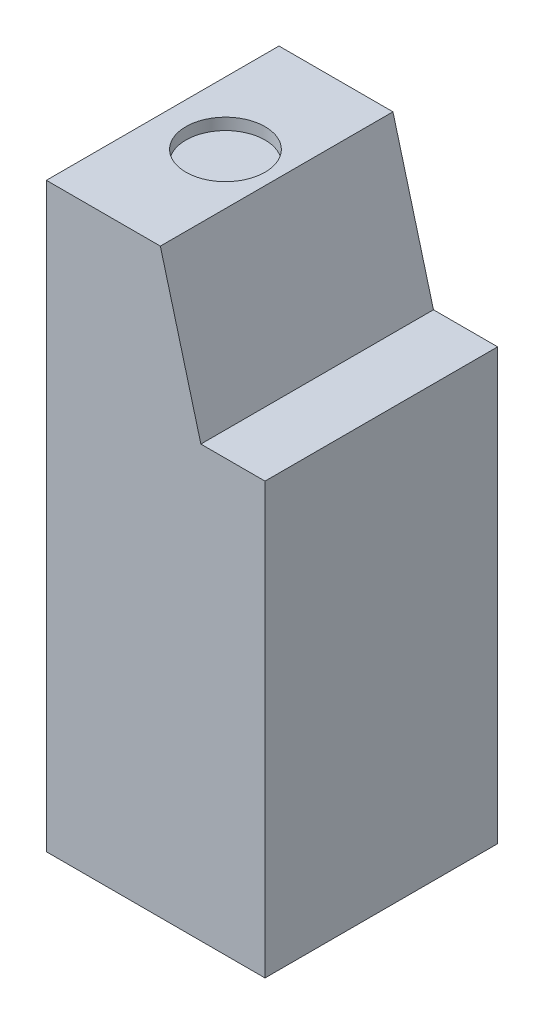
ISO-10303-21;
HEADER;
FILE_DESCRIPTION(('STEP AP214'),'2;1');
FILE_NAME('part.step','',(''),(''),'','','');
FILE_SCHEMA(('AUTOMOTIVE_DESIGN { 1 0 10303 214 1 1 1 1 }'));
ENDSEC;
DATA;
#1=APPLICATION_CONTEXT('core data for automotive mechanical design processes');
#2=APPLICATION_PROTOCOL_DEFINITION('international standard','automotive_design',2000,#1);
#3=PRODUCT_CONTEXT('',#1,'mechanical');
#4=PRODUCT('Part','Part','',(#3));
#5=PRODUCT_RELATED_PRODUCT_CATEGORY('part','',(#4));
#6=PRODUCT_DEFINITION_FORMATION('','',#4);
#7=PRODUCT_DEFINITION_CONTEXT('part definition',#1,'design');
#8=PRODUCT_DEFINITION('design','',#6,#7);
#9=PRODUCT_DEFINITION_SHAPE('','',#8);
#10=(LENGTH_UNIT() NAMED_UNIT(*) SI_UNIT(.MILLI.,.METRE.));
#11=(NAMED_UNIT(*) PLANE_ANGLE_UNIT() SI_UNIT($,.RADIAN.));
#12=(NAMED_UNIT(*) SI_UNIT($,.STERADIAN.) SOLID_ANGLE_UNIT());
#13=UNCERTAINTY_MEASURE_WITH_UNIT(LENGTH_MEASURE(1.E-05),#10,'distance_accuracy_value','');
#14=(GEOMETRIC_REPRESENTATION_CONTEXT(3) GLOBAL_UNCERTAINTY_ASSIGNED_CONTEXT((#13)) GLOBAL_UNIT_ASSIGNED_CONTEXT((#10,
#11,#12)) REPRESENTATION_CONTEXT('',''));
#15=CARTESIAN_POINT('',(0.,0.,0.));
#16=DIRECTION('',(0.,0.,1.));
#17=DIRECTION('',(1.,0.,0.));
#18=AXIS2_PLACEMENT_3D('',#15,#16,#17);
#19=CARTESIAN_POINT('',(0.,18.5,5.));
#20=DIRECTION('',(0.,-1.,0.));
#21=DIRECTION('',(0.,0.,-1.));
#22=AXIS2_PLACEMENT_3D('',#19,#20,#21);
#23=PLANE('',#22);
#24=DIRECTION('',(0.,0.,-1.));
#25=VECTOR('',#24,1.);
#26=CARTESIAN_POINT('',(-2.75833024919772,18.5,5.));
#27=LINE('',#26,#25);
#28=CARTESIAN_POINT('',(-2.75833024919772,18.5,5.));
#29=VERTEX_POINT('',#28);
#30=CARTESIAN_POINT('',(-2.75833024919772,18.5,-5.));
#31=VERTEX_POINT('',#30);
#32=EDGE_CURVE('E50',#29,#31,#27,.T.);
#33=ORIENTED_EDGE('',*,*,#32,.F.);
#34=DIRECTION('',(-1.,0.,0.));
#35=VECTOR('',#34,1.);
#36=CARTESIAN_POINT('',(0.,18.5,5.));
#37=LINE('',#36,#35);
#38=CARTESIAN_POINT('',(0.,18.5,5.));
#39=VERTEX_POINT('',#38);
#40=EDGE_CURVE('E101',#39,#29,#37,.T.);
#41=ORIENTED_EDGE('',*,*,#40,.F.);
#42=DIRECTION('',(0.,0.,-1.));
#43=VECTOR('',#42,1.);
#44=CARTESIAN_POINT('',(0.,18.5,5.));
#45=LINE('',#44,#43);
#46=CARTESIAN_POINT('',(0.,18.5,-5.));
#47=VERTEX_POINT('',#46);
#48=EDGE_CURVE('E42',#39,#47,#45,.T.);
#49=ORIENTED_EDGE('',*,*,#48,.T.);
#50=DIRECTION('',(-1.,0.,0.));
#51=VECTOR('',#50,1.);
#52=CARTESIAN_POINT('',(0.,18.5,-5.));
#53=LINE('',#52,#51);
#54=EDGE_CURVE('E175',#47,#31,#53,.T.);
#55=ORIENTED_EDGE('',*,*,#54,.T.);
#56=EDGE_LOOP('',(#33,#41,#49,#55));
#57=FACE_BOUND('',#56,.T.);
#58=ADVANCED_FACE('F33',(#57),#23,.F.);
#59=CARTESIAN_POINT('',(-9.40000000000001,0.,5.));
#60=DIRECTION('',(0.,1.,0.));
#61=DIRECTION('',(0.,0.,1.));
#62=AXIS2_PLACEMENT_3D('',#59,#60,#61);
#63=PLANE('',#62);
#64=DIRECTION('',(1.,0.,0.));
#65=VECTOR('',#64,1.);
#66=CARTESIAN_POINT('',(-9.40000000000001,0.,-5.));
#67=LINE('',#66,#65);
#68=CARTESIAN_POINT('',(-9.40000000000001,0.,-5.));
#69=VERTEX_POINT('',#68);
#70=CARTESIAN_POINT('',(0.,0.,-5.));
#71=VERTEX_POINT('',#70);
#72=EDGE_CURVE('E129',#69,#71,#67,.T.);
#73=ORIENTED_EDGE('',*,*,#72,.T.);
#74=DIRECTION('',(0.,0.,-1.));
#75=VECTOR('',#74,1.);
#76=CARTESIAN_POINT('',(0.,0.,5.));
#77=LINE('',#76,#75);
#78=CARTESIAN_POINT('',(0.,0.,5.));
#79=VERTEX_POINT('',#78);
#80=EDGE_CURVE('E11',#79,#71,#77,.T.);
#81=ORIENTED_EDGE('',*,*,#80,.F.);
#82=DIRECTION('',(1.,0.,0.));
#83=VECTOR('',#82,1.);
#84=CARTESIAN_POINT('',(-9.40000000000001,0.,5.));
#85=LINE('',#84,#83);
#86=CARTESIAN_POINT('',(-9.40000000000001,0.,5.));
#87=VERTEX_POINT('',#86);
#88=EDGE_CURVE('E124',#87,#79,#85,.T.);
#89=ORIENTED_EDGE('',*,*,#88,.F.);
#90=DIRECTION('',(0.,0.,-1.));
#91=VECTOR('',#90,1.);
#92=CARTESIAN_POINT('',(-9.40000000000001,0.,5.));
#93=LINE('',#92,#91);
#94=EDGE_CURVE('E177',#87,#69,#93,.T.);
#95=ORIENTED_EDGE('',*,*,#94,.T.);
#96=EDGE_LOOP('',(#73,#81,#89,#95));
#97=FACE_BOUND('',#96,.T.);
#98=ADVANCED_FACE('F35',(#97),#63,.F.);
#99=CARTESIAN_POINT('',(0.,0.,5.));
#100=DIRECTION('',(-1.,0.,0.));
#101=DIRECTION('',(0.,-1.,0.));
#102=AXIS2_PLACEMENT_3D('',#99,#100,#101);
#103=PLANE('',#102);
#104=DIRECTION('',(0.,1.,0.));
#105=VECTOR('',#104,1.);
#106=CARTESIAN_POINT('',(0.,0.,-5.));
#107=LINE('',#106,#105);
#108=EDGE_CURVE('E168',#71,#47,#107,.T.);
#109=ORIENTED_EDGE('',*,*,#108,.T.);
#110=ORIENTED_EDGE('',*,*,#48,.F.);
#111=DIRECTION('',(0.,1.,0.));
#112=VECTOR('',#111,1.);
#113=CARTESIAN_POINT('',(0.,0.,5.));
#114=LINE('',#113,#112);
#115=EDGE_CURVE('E82',#79,#39,#114,.T.);
#116=ORIENTED_EDGE('',*,*,#115,.F.);
#117=ORIENTED_EDGE('',*,*,#80,.T.);
#118=EDGE_LOOP('',(#109,#110,#116,#117));
#119=FACE_BOUND('',#118,.T.);
#120=ADVANCED_FACE('F159',(#119),#103,.F.);
#121=CARTESIAN_POINT('',(-9.40000000000001,18.5,5.));
#122=DIRECTION('',(1.,0.,0.));
#123=DIRECTION('',(0.,0.,-1.));
#124=AXIS2_PLACEMENT_3D('',#121,#122,#123);
#125=PLANE('',#124);
#126=DIRECTION('',(0.,-1.,0.));
#127=VECTOR('',#126,1.);
#128=CARTESIAN_POINT('',(-9.40000000000001,18.5,-5.));
#129=LINE('',#128,#127);
#130=CARTESIAN_POINT('',(-9.40000000000001,25.,-5.));
#131=VERTEX_POINT('',#130);
#132=EDGE_CURVE('E77',#131,#69,#129,.T.);
#133=ORIENTED_EDGE('',*,*,#132,.T.);
#134=ORIENTED_EDGE('',*,*,#94,.F.);
#135=DIRECTION('',(0.,-1.,0.));
#136=VECTOR('',#135,1.);
#137=CARTESIAN_POINT('',(-9.40000000000001,18.5,5.));
#138=LINE('',#137,#136);
#139=CARTESIAN_POINT('',(-9.40000000000001,25.,5.));
#140=VERTEX_POINT('',#139);
#141=EDGE_CURVE('E59',#140,#87,#138,.T.);
#142=ORIENTED_EDGE('',*,*,#141,.F.);
#143=DIRECTION('',(0.,0.,-1.));
#144=VECTOR('',#143,1.);
#145=CARTESIAN_POINT('',(-9.40000000000001,25.,5.));
#146=LINE('',#145,#144);
#147=EDGE_CURVE('E112',#140,#131,#146,.T.);
#148=ORIENTED_EDGE('',*,*,#147,.T.);
#149=EDGE_LOOP('',(#133,#134,#142,#148));
#150=FACE_BOUND('',#149,.T.);
#151=ADVANCED_FACE('F162',(#150),#125,.F.);
#152=CARTESIAN_POINT('',(-9.40000000000001,0.,5.));
#153=DIRECTION('',(0.,0.,-1.));
#154=DIRECTION('',(-1.,0.,0.));
#155=AXIS2_PLACEMENT_3D('',#152,#153,#154);
#156=PLANE('',#155);
#157=ORIENTED_EDGE('',*,*,#88,.T.);
#158=ORIENTED_EDGE('',*,*,#115,.T.);
#159=ORIENTED_EDGE('',*,*,#40,.T.);
#160=DIRECTION('',(-0.258819045102518,0.965925826289069,0.));
#161=VECTOR('',#160,1.);
#162=CARTESIAN_POINT('',(-4.5,25.,5.));
#163=LINE('',#162,#161);
#164=CARTESIAN_POINT('',(-4.5,25.,5.));
#165=VERTEX_POINT('',#164);
#166=EDGE_CURVE('E95',#29,#165,#163,.T.);
#167=ORIENTED_EDGE('',*,*,#166,.T.);
#168=DIRECTION('',(-1.,0.,0.));
#169=VECTOR('',#168,1.);
#170=CARTESIAN_POINT('',(-9.40000000000001,25.,5.));
#171=LINE('',#170,#169);
#172=EDGE_CURVE('E99',#165,#140,#171,.T.);
#173=ORIENTED_EDGE('',*,*,#172,.T.);
#174=ORIENTED_EDGE('',*,*,#141,.T.);
#175=EDGE_LOOP('',(#157,#158,#159,#167,#173,#174));
#176=FACE_BOUND('',#175,.T.);
#177=ADVANCED_FACE('F97',(#176),#156,.F.);
#178=CARTESIAN_POINT('',(-9.40000000000001,0.,-5.));
#179=DIRECTION('',(0.,0.,-1.));
#180=DIRECTION('',(-1.,0.,0.));
#181=AXIS2_PLACEMENT_3D('',#178,#179,#180);
#182=PLANE('',#181);
#183=ORIENTED_EDGE('',*,*,#72,.F.);
#184=ORIENTED_EDGE('',*,*,#132,.F.);
#185=DIRECTION('',(-1.,0.,0.));
#186=VECTOR('',#185,1.);
#187=CARTESIAN_POINT('',(-9.40000000000001,25.,-5.));
#188=LINE('',#187,#186);
#189=CARTESIAN_POINT('',(-4.5,25.,-5.));
#190=VERTEX_POINT('',#189);
#191=EDGE_CURVE('E103',#190,#131,#188,.T.);
#192=ORIENTED_EDGE('',*,*,#191,.F.);
#193=DIRECTION('',(-0.258819045102518,0.965925826289069,0.));
#194=VECTOR('',#193,1.);
#195=CARTESIAN_POINT('',(-4.5,25.,-5.));
#196=LINE('',#195,#194);
#197=EDGE_CURVE('E108',#31,#190,#196,.T.);
#198=ORIENTED_EDGE('',*,*,#197,.F.);
#199=ORIENTED_EDGE('',*,*,#54,.F.);
#200=ORIENTED_EDGE('',*,*,#108,.F.);
#201=EDGE_LOOP('',(#183,#184,#192,#198,#199,#200));
#202=FACE_BOUND('',#201,.T.);
#203=ADVANCED_FACE('F152',(#202),#182,.T.);
#204=CARTESIAN_POINT('',(-4.5,25.,5.));
#205=DIRECTION('',(-0.965925826289069,-0.258819045102518,0.));
#206=DIRECTION('',(0.258819045102518,-0.965925826289069,0.));
#207=AXIS2_PLACEMENT_3D('',#204,#205,#206);
#208=PLANE('',#207);
#209=ORIENTED_EDGE('',*,*,#197,.T.);
#210=DIRECTION('',(0.,0.,-1.));
#211=VECTOR('',#210,1.);
#212=CARTESIAN_POINT('',(-4.5,25.,5.));
#213=LINE('',#212,#211);
#214=EDGE_CURVE('E105',#165,#190,#213,.T.);
#215=ORIENTED_EDGE('',*,*,#214,.F.);
#216=ORIENTED_EDGE('',*,*,#166,.F.);
#217=ORIENTED_EDGE('',*,*,#32,.T.);
#218=EDGE_LOOP('',(#209,#215,#216,#217));
#219=FACE_BOUND('',#218,.T.);
#220=ADVANCED_FACE('F106',(#219),#208,.F.);
#221=CARTESIAN_POINT('',(-9.40000000000001,25.,5.));
#222=DIRECTION('',(0.,-1.,0.));
#223=DIRECTION('',(0.,0.,-1.));
#224=AXIS2_PLACEMENT_3D('',#221,#222,#223);
#225=PLANE('',#224);
#226=CARTESIAN_POINT('',(-6.70000000000001,25.,0.));
#227=DIRECTION('',(0.,1.,0.));
#228=DIRECTION('',(0.,0.,1.));
#229=AXIS2_PLACEMENT_3D('',#226,#227,#228);
#230=CIRCLE('',#229,1.7);
#231=CARTESIAN_POINT('',(-6.70000000000001,25.,1.7));
#232=VERTEX_POINT('',#231);
#233=EDGE_CURVE('E119',#232,#232,#230,.T.);
#234=ORIENTED_EDGE('',*,*,#233,.F.);
#235=EDGE_LOOP('',(#234));
#236=FACE_BOUND('',#235,.T.);
#237=ORIENTED_EDGE('',*,*,#191,.T.);
#238=ORIENTED_EDGE('',*,*,#147,.F.);
#239=ORIENTED_EDGE('',*,*,#172,.F.);
#240=ORIENTED_EDGE('',*,*,#214,.T.);
#241=EDGE_LOOP('',(#237,#238,#239,#240));
#242=FACE_BOUND('',#241,.T.);
#243=ADVANCED_FACE('F114',(#236,#242),#225,.F.);
#244=CARTESIAN_POINT('',(-6.70000000000001,24.5,0.));
#245=DIRECTION('',(0.,1.,0.));
#246=DIRECTION('',(0.,0.,1.));
#247=AXIS2_PLACEMENT_3D('',#244,#245,#246);
#248=CYLINDRICAL_SURFACE('',#247,1.7);
#249=CARTESIAN_POINT('',(-6.70000000000001,24.5,0.));
#250=DIRECTION('',(0.,1.,0.));
#251=DIRECTION('',(0.,0.,1.));
#252=AXIS2_PLACEMENT_3D('',#249,#250,#251);
#253=CIRCLE('',#252,1.7);
#254=CARTESIAN_POINT('',(-6.70000000000001,24.5,1.7));
#255=VERTEX_POINT('',#254);
#256=EDGE_CURVE('E133',#255,#255,#253,.T.);
#257=ORIENTED_EDGE('',*,*,#256,.F.);
#258=EDGE_LOOP('',(#257));
#259=FACE_BOUND('',#258,.T.);
#260=ORIENTED_EDGE('',*,*,#233,.T.);
#261=EDGE_LOOP('',(#260));
#262=FACE_BOUND('',#261,.T.);
#263=ADVANCED_FACE('F141',(#259,#262),#248,.F.);
#264=CARTESIAN_POINT('',(-6.70000000000001,24.5,0.));
#265=DIRECTION('',(0.,1.,0.));
#266=DIRECTION('',(0.,0.,1.));
#267=AXIS2_PLACEMENT_3D('',#264,#265,#266);
#268=PLANE('',#267);
#269=ORIENTED_EDGE('',*,*,#256,.T.);
#270=EDGE_LOOP('',(#269));
#271=FACE_BOUND('',#270,.T.);
#272=ADVANCED_FACE('F149',(#271),#268,.T.);
#273=CLOSED_SHELL('',(#58,#98,#120,#151,#177,#203,#220,#243,#263,#272));
#274=MANIFOLD_SOLID_BREP('B2',#273);
#275=ADVANCED_BREP_SHAPE_REPRESENTATION('',(#18,#274),#14);
#276=SHAPE_DEFINITION_REPRESENTATION(#9,#275);
ENDSEC;
END-ISO-10303-21;
